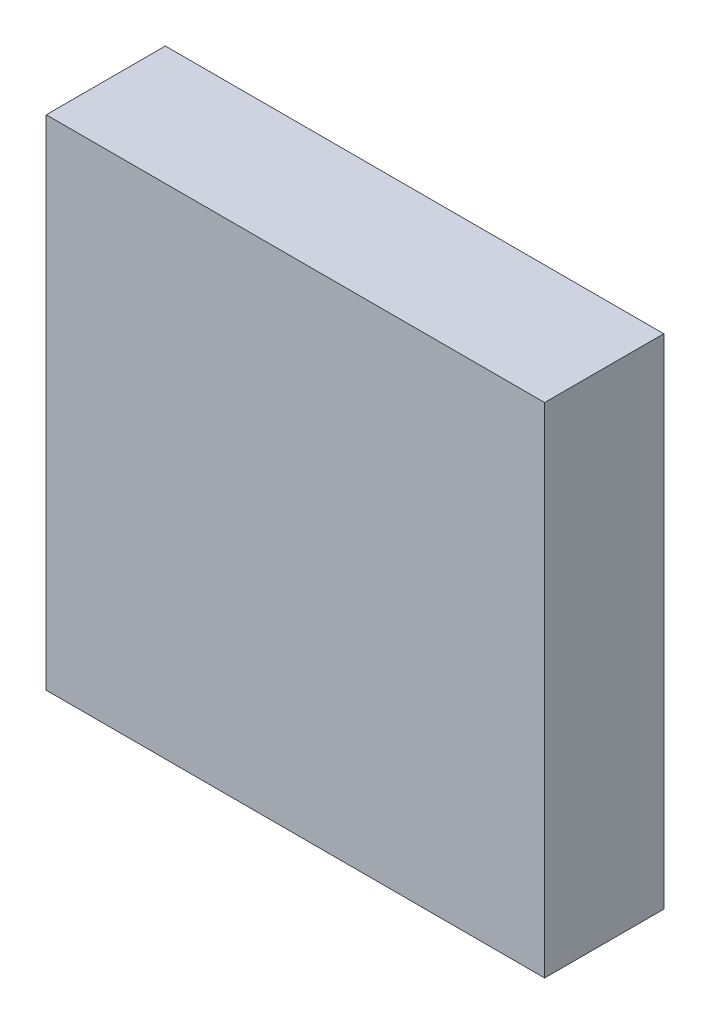
ISO-10303-21;
HEADER;
FILE_DESCRIPTION(('STEP AP214'),'2;1');
FILE_NAME('part.step','',(''),(''),'','','');
FILE_SCHEMA(('AUTOMOTIVE_DESIGN { 1 0 10303 214 1 1 1 1 }'));
ENDSEC;
DATA;
#1=APPLICATION_CONTEXT('core data for automotive mechanical design processes');
#2=APPLICATION_PROTOCOL_DEFINITION('international standard','automotive_design',2000,#1);
#3=PRODUCT_CONTEXT('',#1,'mechanical');
#4=PRODUCT('Part','Part','',(#3));
#5=PRODUCT_RELATED_PRODUCT_CATEGORY('part','',(#4));
#6=PRODUCT_DEFINITION_FORMATION('','',#4);
#7=PRODUCT_DEFINITION_CONTEXT('part definition',#1,'design');
#8=PRODUCT_DEFINITION('design','',#6,#7);
#9=PRODUCT_DEFINITION_SHAPE('','',#8);
#10=(LENGTH_UNIT() NAMED_UNIT(*) SI_UNIT(.MILLI.,.METRE.));
#11=(NAMED_UNIT(*) PLANE_ANGLE_UNIT() SI_UNIT($,.RADIAN.));
#12=(NAMED_UNIT(*) SI_UNIT($,.STERADIAN.) SOLID_ANGLE_UNIT());
#13=UNCERTAINTY_MEASURE_WITH_UNIT(LENGTH_MEASURE(1.E-05),#10,'distance_accuracy_value','');
#14=(GEOMETRIC_REPRESENTATION_CONTEXT(3) GLOBAL_UNCERTAINTY_ASSIGNED_CONTEXT((#13)) GLOBAL_UNIT_ASSIGNED_CONTEXT((#10,
#11,#12)) REPRESENTATION_CONTEXT('',''));
#15=CARTESIAN_POINT('',(0.,0.,0.));
#16=DIRECTION('',(0.,0.,1.));
#17=DIRECTION('',(1.,0.,0.));
#18=AXIS2_PLACEMENT_3D('',#15,#16,#17);
#19=CARTESIAN_POINT('',(8.99999934,-4.50000066,-1.631601964785));
#20=DIRECTION('',(0.,0.,-1.));
#21=DIRECTION('',(-1.,0.,0.));
#22=AXIS2_PLACEMENT_3D('',#19,#20,#21);
#23=PLANE('',#22);
#24=DIRECTION('',(0.,1.,0.));
#25=VECTOR('',#24,1.);
#26=CARTESIAN_POINT('',(6.94999836,-6.55000164,-1.631601964785));
#27=LINE('',#26,#25);
#28=CARTESIAN_POINT('',(6.94999836,-6.55000164,-1.631601964785));
#29=VERTEX_POINT('',#28);
#30=CARTESIAN_POINT('',(6.94999836,-2.44999968,-1.631601964785));
#31=VERTEX_POINT('',#30);
#32=EDGE_CURVE('E68',#29,#31,#27,.T.);
#33=ORIENTED_EDGE('',*,*,#32,.F.);
#34=DIRECTION('',(1.,0.,0.));
#35=VECTOR('',#34,1.);
#36=CARTESIAN_POINT('',(11.05000032,-6.55000164,-1.631601964785));
#37=LINE('',#36,#35);
#38=CARTESIAN_POINT('',(11.05000032,-6.55000164,-1.631601964785));
#39=VERTEX_POINT('',#38);
#40=EDGE_CURVE('E55',#39,#29,#37,.F.);
#41=ORIENTED_EDGE('',*,*,#40,.F.);
#42=DIRECTION('',(0.,1.,0.));
#43=VECTOR('',#42,1.);
#44=CARTESIAN_POINT('',(11.05000032,-2.44999968,-1.631601964785));
#45=LINE('',#44,#43);
#46=CARTESIAN_POINT('',(11.05000032,-2.44999968,-1.631601964785));
#47=VERTEX_POINT('',#46);
#48=EDGE_CURVE('E20',#47,#39,#45,.F.);
#49=ORIENTED_EDGE('',*,*,#48,.F.);
#50=DIRECTION('',(1.,0.,0.));
#51=VECTOR('',#50,1.);
#52=CARTESIAN_POINT('',(6.94999836,-2.44999968,-1.631601964785));
#53=LINE('',#52,#51);
#54=EDGE_CURVE('E80',#31,#47,#53,.T.);
#55=ORIENTED_EDGE('',*,*,#54,.F.);
#56=EDGE_LOOP('',(#33,#41,#49,#55));
#57=FACE_BOUND('',#56,.T.);
#58=ADVANCED_FACE('F17',(#57),#23,.F.);
#59=CARTESIAN_POINT('',(11.05000032,-2.44999968,-2.611602544785));
#60=DIRECTION('',(1.,0.,0.));
#61=DIRECTION('',(0.,0.,-1.));
#62=AXIS2_PLACEMENT_3D('',#59,#60,#61);
#63=PLANE('',#62);
#64=DIRECTION('',(0.,0.,-1.));
#65=VECTOR('',#64,1.);
#66=CARTESIAN_POINT('',(11.05000032,-6.55000164,-2.611602544785));
#67=LINE('',#66,#65);
#68=CARTESIAN_POINT('',(11.05000032,-6.55000164,-2.611602544785));
#69=VERTEX_POINT('',#68);
#70=EDGE_CURVE('E61',#69,#39,#67,.F.);
#71=ORIENTED_EDGE('',*,*,#70,.F.);
#72=DIRECTION('',(0.,1.,0.));
#73=VECTOR('',#72,1.);
#74=CARTESIAN_POINT('',(11.05000032,-4.50000066,-2.611602544785));
#75=LINE('',#74,#73);
#76=CARTESIAN_POINT('',(11.05000032,-2.44999968,-2.611602544785));
#77=VERTEX_POINT('',#76);
#78=EDGE_CURVE('E83',#77,#69,#75,.F.);
#79=ORIENTED_EDGE('',*,*,#78,.F.);
#80=DIRECTION('',(0.,0.,1.));
#81=VECTOR('',#80,1.);
#82=CARTESIAN_POINT('',(11.05000032,-2.44999968,-2.611602544785));
#83=LINE('',#82,#81);
#84=EDGE_CURVE('E64',#47,#77,#83,.F.);
#85=ORIENTED_EDGE('',*,*,#84,.F.);
#86=ORIENTED_EDGE('',*,*,#48,.T.);
#87=EDGE_LOOP('',(#71,#79,#85,#86));
#88=FACE_BOUND('',#87,.T.);
#89=ADVANCED_FACE('F60',(#88),#63,.T.);
#90=CARTESIAN_POINT('',(11.05000032,-6.55000164,-2.611602544785));
#91=DIRECTION('',(0.,-1.,0.));
#92=DIRECTION('',(0.,0.,-1.));
#93=AXIS2_PLACEMENT_3D('',#90,#91,#92);
#94=PLANE('',#93);
#95=DIRECTION('',(0.,0.,1.));
#96=VECTOR('',#95,1.);
#97=CARTESIAN_POINT('',(6.94999836,-6.55000164,-2.611602544785));
#98=LINE('',#97,#96);
#99=CARTESIAN_POINT('',(6.94999836,-6.55000164,-2.611602544785));
#100=VERTEX_POINT('',#99);
#101=EDGE_CURVE('E70',#100,#29,#98,.T.);
#102=ORIENTED_EDGE('',*,*,#101,.F.);
#103=DIRECTION('',(-1.,0.,0.));
#104=VECTOR('',#103,1.);
#105=CARTESIAN_POINT('',(8.99999934,-6.55000164,-2.611602544785));
#106=LINE('',#105,#104);
#107=EDGE_CURVE('E74',#69,#100,#106,.T.);
#108=ORIENTED_EDGE('',*,*,#107,.F.);
#109=ORIENTED_EDGE('',*,*,#70,.T.);
#110=ORIENTED_EDGE('',*,*,#40,.T.);
#111=EDGE_LOOP('',(#102,#108,#109,#110));
#112=FACE_BOUND('',#111,.T.);
#113=ADVANCED_FACE('F72',(#112),#94,.T.);
#114=CARTESIAN_POINT('',(6.94999836,-6.55000164,-2.611602544785));
#115=DIRECTION('',(-1.,0.,0.));
#116=DIRECTION('',(0.,0.,1.));
#117=AXIS2_PLACEMENT_3D('',#114,#115,#116);
#118=PLANE('',#117);
#119=DIRECTION('',(0.,0.,1.));
#120=VECTOR('',#119,1.);
#121=CARTESIAN_POINT('',(6.94999836,-2.44999968,-2.611602544785));
#122=LINE('',#121,#120);
#123=CARTESIAN_POINT('',(6.94999836,-2.44999968,-2.611602544785));
#124=VERTEX_POINT('',#123);
#125=EDGE_CURVE('E35',#124,#31,#122,.T.);
#126=ORIENTED_EDGE('',*,*,#125,.F.);
#127=DIRECTION('',(0.,1.,0.));
#128=VECTOR('',#127,1.);
#129=CARTESIAN_POINT('',(6.94999836,-4.50000066,-2.611602544785));
#130=LINE('',#129,#128);
#131=EDGE_CURVE('E26',#100,#124,#130,.T.);
#132=ORIENTED_EDGE('',*,*,#131,.F.);
#133=ORIENTED_EDGE('',*,*,#101,.T.);
#134=ORIENTED_EDGE('',*,*,#32,.T.);
#135=EDGE_LOOP('',(#126,#132,#133,#134));
#136=FACE_BOUND('',#135,.T.);
#137=ADVANCED_FACE('F89',(#136),#118,.T.);
#138=CARTESIAN_POINT('',(6.94999836,-2.44999968,-2.611602544785));
#139=DIRECTION('',(0.,1.,0.));
#140=DIRECTION('',(0.,0.,1.));
#141=AXIS2_PLACEMENT_3D('',#138,#139,#140);
#142=PLANE('',#141);
#143=ORIENTED_EDGE('',*,*,#84,.T.);
#144=DIRECTION('',(-1.,0.,0.));
#145=VECTOR('',#144,1.);
#146=CARTESIAN_POINT('',(8.99999934,-2.44999968,-2.611602544785));
#147=LINE('',#146,#145);
#148=EDGE_CURVE('E11',#124,#77,#147,.F.);
#149=ORIENTED_EDGE('',*,*,#148,.F.);
#150=ORIENTED_EDGE('',*,*,#125,.T.);
#151=ORIENTED_EDGE('',*,*,#54,.T.);
#152=EDGE_LOOP('',(#143,#149,#150,#151));
#153=FACE_BOUND('',#152,.T.);
#154=ADVANCED_FACE('F91',(#153),#142,.T.);
#155=CARTESIAN_POINT('',(8.99999934,-4.50000066,-2.611602544785));
#156=DIRECTION('',(0.,0.,-1.));
#157=DIRECTION('',(-1.,0.,0.));
#158=AXIS2_PLACEMENT_3D('',#155,#156,#157);
#159=PLANE('',#158);
#160=ORIENTED_EDGE('',*,*,#131,.T.);
#161=ORIENTED_EDGE('',*,*,#148,.T.);
#162=ORIENTED_EDGE('',*,*,#78,.T.);
#163=ORIENTED_EDGE('',*,*,#107,.T.);
#164=EDGE_LOOP('',(#160,#161,#162,#163));
#165=FACE_BOUND('',#164,.T.);
#166=ADVANCED_FACE('F88',(#165),#159,.T.);
#167=CLOSED_SHELL('',(#58,#89,#113,#137,#154,#166));
#168=MANIFOLD_SOLID_BREP('B1',#167);
#169=ADVANCED_BREP_SHAPE_REPRESENTATION('',(#18,#168),#14);
#170=SHAPE_DEFINITION_REPRESENTATION(#9,#169);
ENDSEC;
END-ISO-10303-21;
